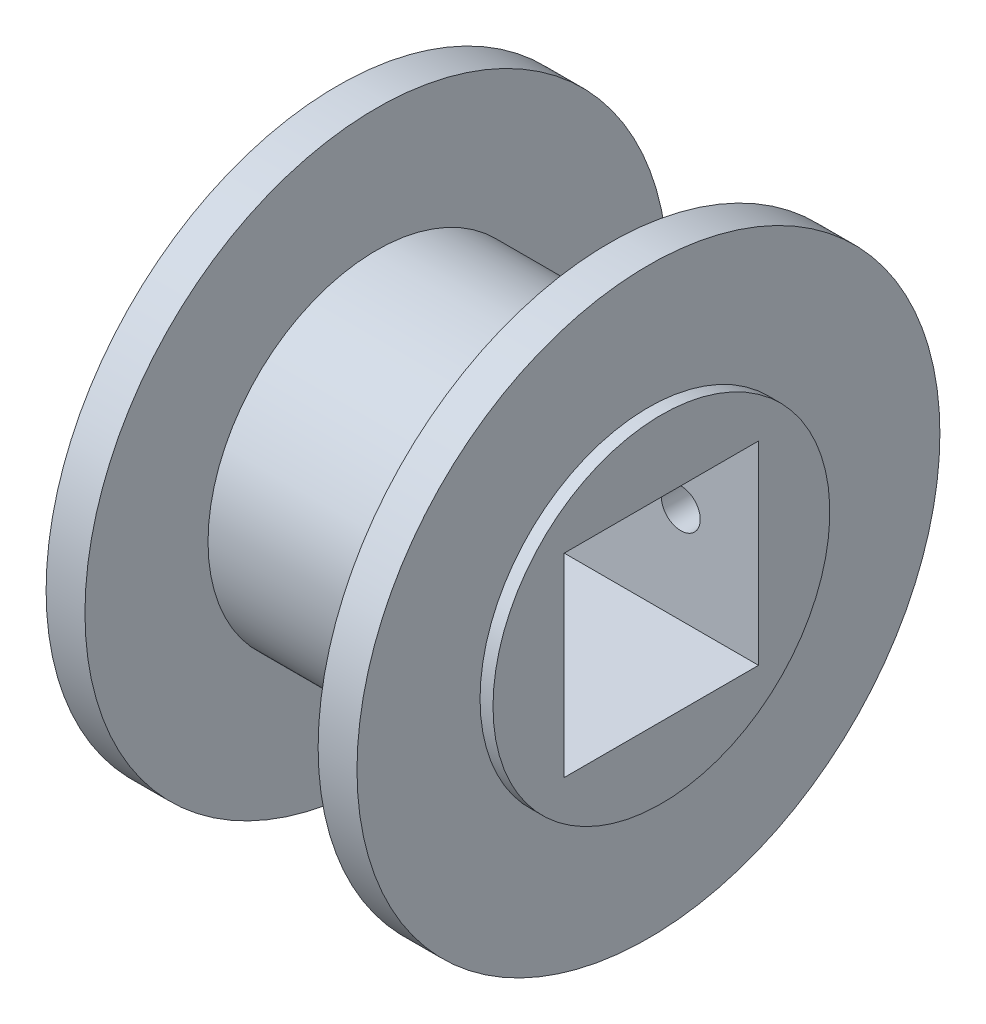
ISO-10303-21;
HEADER;
FILE_DESCRIPTION(('STEP AP214'),'2;1');
FILE_NAME('part.step','',(''),(''),'','','');
FILE_SCHEMA(('AUTOMOTIVE_DESIGN { 1 0 10303 214 1 1 1 1 }'));
ENDSEC;
DATA;
#1=APPLICATION_CONTEXT('core data for automotive mechanical design processes');
#2=APPLICATION_PROTOCOL_DEFINITION('international standard','automotive_design',2000,#1);
#3=PRODUCT_CONTEXT('',#1,'mechanical');
#4=PRODUCT('Part','Part','',(#3));
#5=PRODUCT_RELATED_PRODUCT_CATEGORY('part','',(#4));
#6=PRODUCT_DEFINITION_FORMATION('','',#4);
#7=PRODUCT_DEFINITION_CONTEXT('part definition',#1,'design');
#8=PRODUCT_DEFINITION('design','',#6,#7);
#9=PRODUCT_DEFINITION_SHAPE('','',#8);
#10=(LENGTH_UNIT() NAMED_UNIT(*) SI_UNIT(.MILLI.,.METRE.));
#11=(NAMED_UNIT(*) PLANE_ANGLE_UNIT() SI_UNIT($,.RADIAN.));
#12=(NAMED_UNIT(*) SI_UNIT($,.STERADIAN.) SOLID_ANGLE_UNIT());
#13=UNCERTAINTY_MEASURE_WITH_UNIT(LENGTH_MEASURE(1.E-05),#10,'distance_accuracy_value','');
#14=(GEOMETRIC_REPRESENTATION_CONTEXT(3) GLOBAL_UNCERTAINTY_ASSIGNED_CONTEXT((#13)) GLOBAL_UNIT_ASSIGNED_CONTEXT((#10,
#11,#12)) REPRESENTATION_CONTEXT('',''));
#15=CARTESIAN_POINT('',(0.,0.,0.));
#16=DIRECTION('',(0.,0.,1.));
#17=DIRECTION('',(1.,0.,0.));
#18=AXIS2_PLACEMENT_3D('',#15,#16,#17);
#19=CARTESIAN_POINT('',(13.,7.5,0.));
#20=DIRECTION('',(-1.,0.,0.));
#21=DIRECTION('',(0.,0.,1.));
#22=AXIS2_PLACEMENT_3D('',#19,#20,#21);
#23=PLANE('',#22);
#24=CARTESIAN_POINT('',(13.,0.,0.));
#25=DIRECTION('',(-1.,0.,0.));
#26=DIRECTION('',(0.,0.,1.));
#27=AXIS2_PLACEMENT_3D('',#24,#25,#26);
#28=CIRCLE('',#27,13.);
#29=CARTESIAN_POINT('',(13.,0.,13.));
#30=VERTEX_POINT('',#29);
#31=EDGE_CURVE('E11',#30,#30,#28,.T.);
#32=ORIENTED_EDGE('',*,*,#31,.F.);
#33=EDGE_LOOP('',(#32));
#34=FACE_BOUND('',#33,.T.);
#35=DIRECTION('',(0.,0.,1.));
#36=VECTOR('',#35,1.);
#37=CARTESIAN_POINT('',(13.,7.5,7.5));
#38=LINE('',#37,#36);
#39=CARTESIAN_POINT('',(13.,7.5,-7.5));
#40=VERTEX_POINT('',#39);
#41=CARTESIAN_POINT('',(13.,7.5,7.5));
#42=VERTEX_POINT('',#41);
#43=EDGE_CURVE('E111',#40,#42,#38,.T.);
#44=ORIENTED_EDGE('',*,*,#43,.F.);
#45=DIRECTION('',(0.,1.,0.));
#46=VECTOR('',#45,1.);
#47=CARTESIAN_POINT('',(13.,-7.5,-7.5));
#48=LINE('',#47,#46);
#49=CARTESIAN_POINT('',(13.,-7.5,-7.5));
#50=VERTEX_POINT('',#49);
#51=EDGE_CURVE('E54',#50,#40,#48,.T.);
#52=ORIENTED_EDGE('',*,*,#51,.F.);
#53=DIRECTION('',(0.,0.,-1.));
#54=VECTOR('',#53,1.);
#55=CARTESIAN_POINT('',(13.,-7.5,7.5));
#56=LINE('',#55,#54);
#57=CARTESIAN_POINT('',(13.,-7.5,7.5));
#58=VERTEX_POINT('',#57);
#59=EDGE_CURVE('E87',#58,#50,#56,.T.);
#60=ORIENTED_EDGE('',*,*,#59,.F.);
#61=DIRECTION('',(0.,-1.,0.));
#62=VECTOR('',#61,1.);
#63=CARTESIAN_POINT('',(13.,-7.5,7.5));
#64=LINE('',#63,#62);
#65=EDGE_CURVE('E115',#42,#58,#64,.T.);
#66=ORIENTED_EDGE('',*,*,#65,.F.);
#67=EDGE_LOOP('',(#44,#52,#60,#66));
#68=FACE_BOUND('',#67,.T.);
#69=ADVANCED_FACE('F38',(#34,#68),#23,.F.);
#70=CARTESIAN_POINT('',(0.,0.,0.));
#71=DIRECTION('',(-1.,0.,0.));
#72=DIRECTION('',(0.,0.,1.));
#73=AXIS2_PLACEMENT_3D('',#70,#71,#72);
#74=CYLINDRICAL_SURFACE('',#73,13.);
#75=CARTESIAN_POINT('',(12.,0.,0.));
#76=DIRECTION('',(-1.,0.,0.));
#77=DIRECTION('',(0.,0.,1.));
#78=AXIS2_PLACEMENT_3D('',#75,#76,#77);
#79=CIRCLE('',#78,13.);
#80=CARTESIAN_POINT('',(12.,0.,13.));
#81=VERTEX_POINT('',#80);
#82=EDGE_CURVE('E47',#81,#81,#79,.T.);
#83=ORIENTED_EDGE('',*,*,#82,.F.);
#84=EDGE_LOOP('',(#83));
#85=FACE_BOUND('',#84,.T.);
#86=ORIENTED_EDGE('',*,*,#31,.T.);
#87=EDGE_LOOP('',(#86));
#88=FACE_BOUND('',#87,.T.);
#89=ADVANCED_FACE('F167',(#85,#88),#74,.T.);
#90=CARTESIAN_POINT('',(12.,13.,0.));
#91=DIRECTION('',(-1.,0.,0.));
#92=DIRECTION('',(0.,0.,1.));
#93=AXIS2_PLACEMENT_3D('',#90,#91,#92);
#94=PLANE('',#93);
#95=CARTESIAN_POINT('',(12.,0.,0.));
#96=DIRECTION('',(-1.,0.,0.));
#97=DIRECTION('',(0.,0.,1.));
#98=AXIS2_PLACEMENT_3D('',#95,#96,#97);
#99=CIRCLE('',#98,22.5);
#100=CARTESIAN_POINT('',(12.,0.,22.5));
#101=VERTEX_POINT('',#100);
#102=EDGE_CURVE('E157',#101,#101,#99,.T.);
#103=ORIENTED_EDGE('',*,*,#102,.F.);
#104=EDGE_LOOP('',(#103));
#105=FACE_BOUND('',#104,.T.);
#106=ORIENTED_EDGE('',*,*,#82,.T.);
#107=EDGE_LOOP('',(#106));
#108=FACE_BOUND('',#107,.T.);
#109=ADVANCED_FACE('F165',(#105,#108),#94,.F.);
#110=CARTESIAN_POINT('',(0.,0.,0.));
#111=DIRECTION('',(-1.,0.,0.));
#112=DIRECTION('',(0.,0.,1.));
#113=AXIS2_PLACEMENT_3D('',#110,#111,#112);
#114=CYLINDRICAL_SURFACE('',#113,22.5);
#115=CARTESIAN_POINT('',(9.,0.,0.));
#116=DIRECTION('',(-1.,0.,0.));
#117=DIRECTION('',(0.,0.,1.));
#118=AXIS2_PLACEMENT_3D('',#115,#116,#117);
#119=CIRCLE('',#118,22.5);
#120=CARTESIAN_POINT('',(9.,0.,22.5));
#121=VERTEX_POINT('',#120);
#122=EDGE_CURVE('E153',#121,#121,#119,.T.);
#123=ORIENTED_EDGE('',*,*,#122,.F.);
#124=EDGE_LOOP('',(#123));
#125=FACE_BOUND('',#124,.T.);
#126=ORIENTED_EDGE('',*,*,#102,.T.);
#127=EDGE_LOOP('',(#126));
#128=FACE_BOUND('',#127,.T.);
#129=ADVANCED_FACE('F296',(#125,#128),#114,.T.);
#130=CARTESIAN_POINT('',(9.,22.5,0.));
#131=DIRECTION('',(1.,0.,0.));
#132=DIRECTION('',(0.,0.,-1.));
#133=AXIS2_PLACEMENT_3D('',#130,#131,#132);
#134=PLANE('',#133);
#135=CARTESIAN_POINT('',(8.99999999999999,0.,0.));
#136=DIRECTION('',(-1.,0.,0.));
#137=DIRECTION('',(0.,0.,1.));
#138=AXIS2_PLACEMENT_3D('',#135,#136,#137);
#139=CIRCLE('',#138,13.);
#140=CARTESIAN_POINT('',(8.99999999999999,0.,13.));
#141=VERTEX_POINT('',#140);
#142=EDGE_CURVE('E149',#141,#141,#139,.T.);
#143=ORIENTED_EDGE('',*,*,#142,.F.);
#144=EDGE_LOOP('',(#143));
#145=FACE_BOUND('',#144,.T.);
#146=ORIENTED_EDGE('',*,*,#122,.T.);
#147=EDGE_LOOP('',(#146));
#148=FACE_BOUND('',#147,.T.);
#149=ADVANCED_FACE('F217',(#145,#148),#134,.F.);
#150=CARTESIAN_POINT('',(0.,0.,0.));
#151=DIRECTION('',(-1.,0.,0.));
#152=DIRECTION('',(0.,0.,1.));
#153=AXIS2_PLACEMENT_3D('',#150,#151,#152);
#154=CYLINDRICAL_SURFACE('',#153,13.);
#155=CARTESIAN_POINT('',(8.5,0.,-13.));
#156=CARTESIAN_POINT('',(8.49999640316709,0.0839563147427413,-12.9999989044515));
#157=CARTESIAN_POINT('',(8.49292758496519,0.167966345196186,-12.999178081572));
#158=CARTESIAN_POINT('',(8.46483826496662,0.333652235419371,-12.995982599614));
#159=CARTESIAN_POINT('',(8.44380286531638,0.415325505475652,-12.9936062813601));
#160=CARTESIAN_POINT('',(8.38840533385724,0.57391497224922,-12.9875677351869));
#161=CARTESIAN_POINT('',(8.35405179569065,0.650834199520698,-12.9839063366207));
#162=CARTESIAN_POINT('',(8.27301111812132,0.79779979378714,-12.9757057473599));
#163=CARTESIAN_POINT('',(8.22632623210123,0.867847413269117,-12.9711667170809));
#164=CARTESIAN_POINT('',(8.12171196440117,0.999427807179226,-12.9616943551208));
#165=CARTESIAN_POINT('',(8.06373605262275,1.06092347729183,-12.9567594432832));
#166=CARTESIAN_POINT('',(7.93828516324756,1.17333502414497,-12.9470643855765));
#167=CARTESIAN_POINT('',(7.87080972079665,1.2242503828419,-12.9423042482743));
#168=CARTESIAN_POINT('',(7.72803733610484,1.3141916873334,-12.9334819604022));
#169=CARTESIAN_POINT('',(7.65271863992229,1.3531833171573,-12.9294218388056));
#170=CARTESIAN_POINT('',(7.49654783804118,1.41795120910938,-12.9224797052987));
#171=CARTESIAN_POINT('',(7.41569591201296,1.44372790011126,-12.9195976551562));
#172=CARTESIAN_POINT('',(7.25113647537628,1.48122247723766,-12.9153528047108));
#173=CARTESIAN_POINT('',(7.1674433262594,1.49300261981048,-12.9139832786549));
#174=CARTESIAN_POINT('',(6.99925756045587,1.50236226854616,-12.9128978570991));
#175=CARTESIAN_POINT('',(6.91476497143115,1.49994226427626,-12.9131819045903));
#176=CARTESIAN_POINT('',(6.7478106867289,1.48102150197295,-12.9153653842397));
#177=CARTESIAN_POINT('',(6.6653411304074,1.46458907258954,-12.9172569773873));
#178=CARTESIAN_POINT('',(6.50433810598175,1.41821640637187,-12.9224301836669));
#179=CARTESIAN_POINT('',(6.42580470681433,1.38827593305336,-12.9257118211342));
#180=CARTESIAN_POINT('',(6.2746895307639,1.31566282618376,-12.9333043079058));
#181=CARTESIAN_POINT('',(6.20212227049772,1.27296024500285,-12.9376175732259));
#182=CARTESIAN_POINT('',(6.06515827049275,1.17605655290097,-12.9467853893456));
#183=CARTESIAN_POINT('',(6.00076184949449,1.12185499363063,-12.9516399612475));
#184=CARTESIAN_POINT('',(5.88157071619168,1.0031120359915,-12.9613782949516));
#185=CARTESIAN_POINT('',(5.82683470870206,0.938511694342139,-12.9662620604919));
#186=CARTESIAN_POINT('',(5.72897438783242,0.801008592236029,-12.9754816969276));
#187=CARTESIAN_POINT('',(5.68585009493268,0.728105817136098,-12.9798175668567));
#188=CARTESIAN_POINT('',(5.61243828715518,0.57602390567987,-12.9874550212078));
#189=CARTESIAN_POINT('',(5.58215416157141,0.496843118716624,-12.9907563324875));
#190=CARTESIAN_POINT('',(5.5353274726576,0.334473831095742,-12.9959501177405));
#191=CARTESIAN_POINT('',(5.51878436163703,0.251285490311374,-12.9978426478647));
#192=CARTESIAN_POINT('',(5.49998472362037,0.0837704200050163,-12.999998373659));
#193=CARTESIAN_POINT('',(5.49764727106811,-0.000547113543201662,-13.0002707984128));
#194=CARTESIAN_POINT('',(5.50711215461104,-0.168372695685007,-12.9991804669134));
#195=CARTESIAN_POINT('',(5.51891423501223,-0.251880758889224,-12.9978177402298));
#196=CARTESIAN_POINT('',(5.556255972808,-0.415480266956157,-12.993616027243));
#197=CARTESIAN_POINT('',(5.58175732870876,-0.495580568872891,-12.9907811576039));
#198=CARTESIAN_POINT('',(5.64573409622904,-0.650367161714356,-12.9839527929212));
#199=CARTESIAN_POINT('',(5.68420988816443,-0.725053293857114,-12.9799592639147));
#200=CARTESIAN_POINT('',(5.77324114512289,-0.867254744569763,-12.9712363785455));
#201=CARTESIAN_POINT('',(5.82384929591281,-0.934736878832464,-12.9665038451426));
#202=CARTESIAN_POINT('',(5.93563374481516,-1.06027784673838,-12.9568430886348));
#203=CARTESIAN_POINT('',(5.99681039844914,-1.11833636324618,-12.9519148589511));
#204=CARTESIAN_POINT('',(6.12835038533593,-1.22366664140003,-12.9423899602444));
#205=CARTESIAN_POINT('',(6.19875664350889,-1.27088497439797,-12.9377950067668));
#206=CARTESIAN_POINT('',(6.34654757584496,-1.35282617315314,-12.9294843210235));
#207=CARTESIAN_POINT('',(6.42393212787651,-1.38754925754463,-12.9257685733744));
#208=CARTESIAN_POINT('',(6.58330615373548,-1.44342658284102,-12.9196483466479));
#209=CARTESIAN_POINT('',(6.66528470793035,-1.46461162925533,-12.91724089246));
#210=CARTESIAN_POINT('',(6.83166493951435,-1.49291104062265,-12.9140010380224));
#211=CARTESIAN_POINT('',(6.91606652196452,-1.50002595610949,-12.9131685761468));
#212=CARTESIAN_POINT('',(7.08436565375942,-1.49997405326829,-12.9131745631781));
#213=CARTESIAN_POINT('',(7.16826324181099,-1.49289116482699,-12.9140031925958));
#214=CARTESIAN_POINT('',(7.33366750199321,-1.46482172327171,-12.9172169582806));
#215=CARTESIAN_POINT('',(7.41517417276497,-1.44383516225564,-12.9196020954322));
#216=CARTESIAN_POINT('',(7.57347609168934,-1.38857911797313,-12.9256572251488));
#217=CARTESIAN_POINT('',(7.65027254258118,-1.35431304208042,-12.9293268880955));
#218=CARTESIAN_POINT('',(7.79703840038788,-1.27347900341466,-12.9375381901497));
#219=CARTESIAN_POINT('',(7.86700777212213,-1.22691097725304,-12.9420798337501));
#220=CARTESIAN_POINT('',(7.99856295332931,-1.12248173071088,-12.9515555600008));
#221=CARTESIAN_POINT('',(8.06009892117498,-1.06455790771248,-12.9564917239034));
#222=CARTESIAN_POINT('',(8.17261111489076,-0.939190054186289,-12.9661816355574));
#223=CARTESIAN_POINT('',(8.22358483240876,-0.87174376861755,-12.9709353397599));
#224=CARTESIAN_POINT('',(8.31366356407028,-0.728996893197094,-12.9797415177439));
#225=CARTESIAN_POINT('',(8.35272930568544,-0.653671391511423,-12.9837916526637));
#226=CARTESIAN_POINT('',(8.41760310503945,-0.497527270565884,-12.9907101076695));
#227=CARTESIAN_POINT('',(8.44342579213557,-0.4167148249134,-12.993579731148));
#228=CARTESIAN_POINT('',(8.47479285483811,-0.279556305332051,-12.9971099824635));
#229=CARTESIAN_POINT('',(8.48423222713368,-0.224080319679963,-12.9981885527758));
#230=CARTESIAN_POINT('',(8.49683698528068,-0.112410914672189,-12.9996339262189));
#231=CARTESIAN_POINT('',(8.50000240845436,-0.0562174995863233,-13.0000007335839));
#232=CARTESIAN_POINT('',(8.5,0.,-13.));
#233=B_SPLINE_CURVE_WITH_KNOTS('',3,(#155,#156,#157,#158,#159,#160,#161,#162,#163,#164,#165,
#166,#167,#168,#169,#170,#171,#172,#173,#174,#175,#176,#177,#178,#179,#180,#181,#182,#183,#184,
#185,#186,#187,#188,#189,#190,#191,#192,#193,#194,#195,#196,#197,#198,#199,#200,#201,#202,#203,
#204,#205,#206,#207,#208,#209,#210,#211,#212,#213,#214,#215,#216,#217,#218,#219,#220,#221,#222,
#223,#224,#225,#226,#227,#228,#229,#230,#231,#232),.UNSPECIFIED.,.T.,.F.,(4,2,2,2,2,2,2,2,2,2,2,
2,2,2,2,2,2,2,2,2,2,2,2,2,2,2,2,2,2,2,2,2,2,2,2,2,2,2,4),(0.,0.251663624421978,
0.503596125244171,0.75536633432109,1.00709056767771,1.25987498270023,1.51267177188699,
1.76618939688668,2.0196987937799,2.27207631201581,2.52444512928255,2.77559031440111,
3.02673989646913,3.27848351780672,3.53023695652505,3.78347119880911,4.0367058877347,
4.29000737900445,4.54329877367693,4.79514587715501,5.04698842639316,5.2981304917502,
5.54927991940194,5.80154039645154,6.05380936112788,6.30729621090899,6.56077862511548,
6.81368217226278,7.0665758236448,7.31797891068329,7.56938214060554,7.82072090595902,
8.07206096641734,8.32482769676521,8.57765438622356,8.83130609524226,9.08467699305618,
9.25319301127889,9.42170802703663),.UNSPECIFIED.);
#234=CARTESIAN_POINT('',(8.5,0.,-13.));
#235=VERTEX_POINT('',#234);
#236=EDGE_CURVE('E112',#235,#235,#233,.T.);
#237=ORIENTED_EDGE('',*,*,#236,.T.);
#238=EDGE_LOOP('',(#237));
#239=FACE_BOUND('',#238,.T.);
#240=CARTESIAN_POINT('',(-9.,0.,0.));
#241=DIRECTION('',(-1.,0.,0.));
#242=DIRECTION('',(0.,0.,1.));
#243=AXIS2_PLACEMENT_3D('',#240,#241,#242);
#244=CIRCLE('',#243,13.);
#245=CARTESIAN_POINT('',(-9.,0.,13.));
#246=VERTEX_POINT('',#245);
#247=EDGE_CURVE('E145',#246,#246,#244,.T.);
#248=ORIENTED_EDGE('',*,*,#247,.F.);
#249=EDGE_LOOP('',(#248));
#250=FACE_BOUND('',#249,.T.);
#251=ORIENTED_EDGE('',*,*,#142,.T.);
#252=EDGE_LOOP('',(#251));
#253=FACE_BOUND('',#252,.T.);
#254=ADVANCED_FACE('F212',(#239,#250,#253),#154,.T.);
#255=CARTESIAN_POINT('',(-9.,22.5,0.));
#256=DIRECTION('',(-1.,0.,0.));
#257=DIRECTION('',(0.,0.,1.));
#258=AXIS2_PLACEMENT_3D('',#255,#256,#257);
#259=PLANE('',#258);
#260=CARTESIAN_POINT('',(-9.,0.,0.));
#261=DIRECTION('',(-1.,0.,0.));
#262=DIRECTION('',(0.,0.,1.));
#263=AXIS2_PLACEMENT_3D('',#260,#261,#262);
#264=CIRCLE('',#263,22.5);
#265=CARTESIAN_POINT('',(-9.,0.,22.5));
#266=VERTEX_POINT('',#265);
#267=EDGE_CURVE('E141',#266,#266,#264,.T.);
#268=ORIENTED_EDGE('',*,*,#267,.F.);
#269=EDGE_LOOP('',(#268));
#270=FACE_BOUND('',#269,.T.);
#271=ORIENTED_EDGE('',*,*,#247,.T.);
#272=EDGE_LOOP('',(#271));
#273=FACE_BOUND('',#272,.T.);
#274=ADVANCED_FACE('F208',(#270,#273),#259,.F.);
#275=CARTESIAN_POINT('',(0.,0.,0.));
#276=DIRECTION('',(-1.,0.,0.));
#277=DIRECTION('',(0.,0.,1.));
#278=AXIS2_PLACEMENT_3D('',#275,#276,#277);
#279=CYLINDRICAL_SURFACE('',#278,22.5);
#280=CARTESIAN_POINT('',(-12.,0.,0.));
#281=DIRECTION('',(-1.,0.,0.));
#282=DIRECTION('',(0.,0.,1.));
#283=AXIS2_PLACEMENT_3D('',#280,#281,#282);
#284=CIRCLE('',#283,22.5);
#285=CARTESIAN_POINT('',(-12.,0.,22.5));
#286=VERTEX_POINT('',#285);
#287=EDGE_CURVE('E137',#286,#286,#284,.T.);
#288=ORIENTED_EDGE('',*,*,#287,.F.);
#289=EDGE_LOOP('',(#288));
#290=FACE_BOUND('',#289,.T.);
#291=ORIENTED_EDGE('',*,*,#267,.T.);
#292=EDGE_LOOP('',(#291));
#293=FACE_BOUND('',#292,.T.);
#294=ADVANCED_FACE('F204',(#290,#293),#279,.T.);
#295=CARTESIAN_POINT('',(-12.,13.,0.));
#296=DIRECTION('',(1.,0.,0.));
#297=DIRECTION('',(0.,0.,-1.));
#298=AXIS2_PLACEMENT_3D('',#295,#296,#297);
#299=PLANE('',#298);
#300=CARTESIAN_POINT('',(-12.,0.,0.));
#301=DIRECTION('',(-1.,0.,0.));
#302=DIRECTION('',(0.,0.,1.));
#303=AXIS2_PLACEMENT_3D('',#300,#301,#302);
#304=CIRCLE('',#303,13.);
#305=CARTESIAN_POINT('',(-12.,0.,13.));
#306=VERTEX_POINT('',#305);
#307=EDGE_CURVE('E133',#306,#306,#304,.T.);
#308=ORIENTED_EDGE('',*,*,#307,.F.);
#309=EDGE_LOOP('',(#308));
#310=FACE_BOUND('',#309,.T.);
#311=ORIENTED_EDGE('',*,*,#287,.T.);
#312=EDGE_LOOP('',(#311));
#313=FACE_BOUND('',#312,.T.);
#314=ADVANCED_FACE('F200',(#310,#313),#299,.F.);
#315=CARTESIAN_POINT('',(0.,0.,0.));
#316=DIRECTION('',(-1.,0.,0.));
#317=DIRECTION('',(0.,0.,1.));
#318=AXIS2_PLACEMENT_3D('',#315,#316,#317);
#319=CYLINDRICAL_SURFACE('',#318,13.);
#320=CARTESIAN_POINT('',(-13.,0.,0.));
#321=DIRECTION('',(-1.,0.,0.));
#322=DIRECTION('',(0.,0.,1.));
#323=AXIS2_PLACEMENT_3D('',#320,#321,#322);
#324=CIRCLE('',#323,13.);
#325=CARTESIAN_POINT('',(-13.,0.,13.));
#326=VERTEX_POINT('',#325);
#327=EDGE_CURVE('E123',#326,#326,#324,.T.);
#328=ORIENTED_EDGE('',*,*,#327,.F.);
#329=EDGE_LOOP('',(#328));
#330=FACE_BOUND('',#329,.T.);
#331=ORIENTED_EDGE('',*,*,#307,.T.);
#332=EDGE_LOOP('',(#331));
#333=FACE_BOUND('',#332,.T.);
#334=ADVANCED_FACE('F197',(#330,#333),#319,.T.);
#335=CARTESIAN_POINT('',(-13.,7.5,0.));
#336=DIRECTION('',(1.,0.,0.));
#337=DIRECTION('',(0.,0.,-1.));
#338=AXIS2_PLACEMENT_3D('',#335,#336,#337);
#339=PLANE('',#338);
#340=DIRECTION('',(0.,-1.,0.));
#341=VECTOR('',#340,1.);
#342=CARTESIAN_POINT('',(-13.,-7.5,7.5));
#343=LINE('',#342,#341);
#344=CARTESIAN_POINT('',(-13.,7.5,7.5));
#345=VERTEX_POINT('',#344);
#346=CARTESIAN_POINT('',(-13.,-7.5,7.5));
#347=VERTEX_POINT('',#346);
#348=EDGE_CURVE('E101',#345,#347,#343,.T.);
#349=ORIENTED_EDGE('',*,*,#348,.T.);
#350=DIRECTION('',(0.,0.,-1.));
#351=VECTOR('',#350,1.);
#352=CARTESIAN_POINT('',(-13.,-7.5,7.5));
#353=LINE('',#352,#351);
#354=CARTESIAN_POINT('',(-13.,-7.5,-7.5));
#355=VERTEX_POINT('',#354);
#356=EDGE_CURVE('E84',#347,#355,#353,.T.);
#357=ORIENTED_EDGE('',*,*,#356,.T.);
#358=DIRECTION('',(0.,1.,0.));
#359=VECTOR('',#358,1.);
#360=CARTESIAN_POINT('',(-13.,-7.5,-7.5));
#361=LINE('',#360,#359);
#362=CARTESIAN_POINT('',(-13.,7.5,-7.5));
#363=VERTEX_POINT('',#362);
#364=EDGE_CURVE('E80',#355,#363,#361,.T.);
#365=ORIENTED_EDGE('',*,*,#364,.T.);
#366=DIRECTION('',(0.,0.,1.));
#367=VECTOR('',#366,1.);
#368=CARTESIAN_POINT('',(-13.,7.5,7.5));
#369=LINE('',#368,#367);
#370=EDGE_CURVE('E62',#363,#345,#369,.T.);
#371=ORIENTED_EDGE('',*,*,#370,.T.);
#372=EDGE_LOOP('',(#349,#357,#365,#371));
#373=FACE_BOUND('',#372,.T.);
#374=ORIENTED_EDGE('',*,*,#327,.T.);
#375=EDGE_LOOP('',(#374));
#376=FACE_BOUND('',#375,.T.);
#377=ADVANCED_FACE('F81',(#373,#376),#339,.F.);
#378=CARTESIAN_POINT('',(-13.,-7.5,-7.5));
#379=DIRECTION('',(0.,0.,-1.));
#380=DIRECTION('',(-1.,0.,0.));
#381=AXIS2_PLACEMENT_3D('',#378,#379,#380);
#382=PLANE('',#381);
#383=CARTESIAN_POINT('',(7.,0.,-7.5));
#384=DIRECTION('',(0.,0.,-1.));
#385=DIRECTION('',(-1.,0.,0.));
#386=AXIS2_PLACEMENT_3D('',#383,#384,#385);
#387=CIRCLE('',#386,1.5);
#388=CARTESIAN_POINT('',(5.5,0.,-7.5));
#389=VERTEX_POINT('',#388);
#390=EDGE_CURVE('E41',#389,#389,#387,.T.);
#391=ORIENTED_EDGE('',*,*,#390,.T.);
#392=EDGE_LOOP('',(#391));
#393=FACE_BOUND('',#392,.T.);
#394=ORIENTED_EDGE('',*,*,#364,.F.);
#395=DIRECTION('',(1.,0.,0.));
#396=VECTOR('',#395,1.);
#397=CARTESIAN_POINT('',(-13.,-7.5,-7.5));
#398=LINE('',#397,#396);
#399=EDGE_CURVE('E120',#355,#50,#398,.T.);
#400=ORIENTED_EDGE('',*,*,#399,.T.);
#401=ORIENTED_EDGE('',*,*,#51,.T.);
#402=DIRECTION('',(1.,0.,0.));
#403=VECTOR('',#402,1.);
#404=CARTESIAN_POINT('',(-13.,7.5,-7.5));
#405=LINE('',#404,#403);
#406=EDGE_CURVE('E89',#363,#40,#405,.T.);
#407=ORIENTED_EDGE('',*,*,#406,.F.);
#408=EDGE_LOOP('',(#394,#400,#401,#407));
#409=FACE_BOUND('',#408,.T.);
#410=ADVANCED_FACE('F90',(#393,#409),#382,.F.);
#411=CARTESIAN_POINT('',(-13.,-7.5,7.5));
#412=DIRECTION('',(0.,-1.,0.));
#413=DIRECTION('',(0.,0.,-1.));
#414=AXIS2_PLACEMENT_3D('',#411,#412,#413);
#415=PLANE('',#414);
#416=ORIENTED_EDGE('',*,*,#356,.F.);
#417=DIRECTION('',(1.,0.,0.));
#418=VECTOR('',#417,1.);
#419=CARTESIAN_POINT('',(-13.,-7.5,7.5));
#420=LINE('',#419,#418);
#421=EDGE_CURVE('E124',#347,#58,#420,.T.);
#422=ORIENTED_EDGE('',*,*,#421,.T.);
#423=ORIENTED_EDGE('',*,*,#59,.T.);
#424=ORIENTED_EDGE('',*,*,#399,.F.);
#425=EDGE_LOOP('',(#416,#422,#423,#424));
#426=FACE_BOUND('',#425,.T.);
#427=ADVANCED_FACE('F179',(#426),#415,.F.);
#428=CARTESIAN_POINT('',(-13.,-7.5,7.5));
#429=DIRECTION('',(0.,0.,1.));
#430=DIRECTION('',(1.,0.,0.));
#431=AXIS2_PLACEMENT_3D('',#428,#429,#430);
#432=PLANE('',#431);
#433=ORIENTED_EDGE('',*,*,#348,.F.);
#434=DIRECTION('',(1.,0.,0.));
#435=VECTOR('',#434,1.);
#436=CARTESIAN_POINT('',(-13.,7.5,7.5));
#437=LINE('',#436,#435);
#438=EDGE_CURVE('E95',#345,#42,#437,.T.);
#439=ORIENTED_EDGE('',*,*,#438,.T.);
#440=ORIENTED_EDGE('',*,*,#65,.T.);
#441=ORIENTED_EDGE('',*,*,#421,.F.);
#442=EDGE_LOOP('',(#433,#439,#440,#441));
#443=FACE_BOUND('',#442,.T.);
#444=ADVANCED_FACE('F176',(#443),#432,.F.);
#445=CARTESIAN_POINT('',(-13.,7.5,7.5));
#446=DIRECTION('',(0.,1.,0.));
#447=DIRECTION('',(0.,0.,1.));
#448=AXIS2_PLACEMENT_3D('',#445,#446,#447);
#449=PLANE('',#448);
#450=ORIENTED_EDGE('',*,*,#370,.F.);
#451=ORIENTED_EDGE('',*,*,#406,.T.);
#452=ORIENTED_EDGE('',*,*,#43,.T.);
#453=ORIENTED_EDGE('',*,*,#438,.F.);
#454=EDGE_LOOP('',(#450,#451,#452,#453));
#455=FACE_BOUND('',#454,.T.);
#456=ADVANCED_FACE('F98',(#455),#449,.F.);
#457=CARTESIAN_POINT('',(7.,0.,-22.5));
#458=DIRECTION('',(0.,0.,1.));
#459=DIRECTION('',(1.,0.,0.));
#460=AXIS2_PLACEMENT_3D('',#457,#458,#459);
#461=CYLINDRICAL_SURFACE('',#460,1.5);
#462=ORIENTED_EDGE('',*,*,#390,.F.);
#463=EDGE_LOOP('',(#462));
#464=FACE_BOUND('',#463,.T.);
#465=ORIENTED_EDGE('',*,*,#236,.F.);
#466=EDGE_LOOP('',(#465));
#467=FACE_BOUND('',#466,.T.);
#468=ADVANCED_FACE('F190',(#464,#467),#461,.F.);
#469=CLOSED_SHELL('',(#69,#89,#109,#129,#149,#254,#274,#294,#314,#334,#377,#410,#427,#444,#456,#468));
#470=MANIFOLD_SOLID_BREP('B2',#469);
#471=ADVANCED_BREP_SHAPE_REPRESENTATION('',(#18,#470),#14);
#472=SHAPE_DEFINITION_REPRESENTATION(#9,#471);
ENDSEC;
END-ISO-10303-21;
